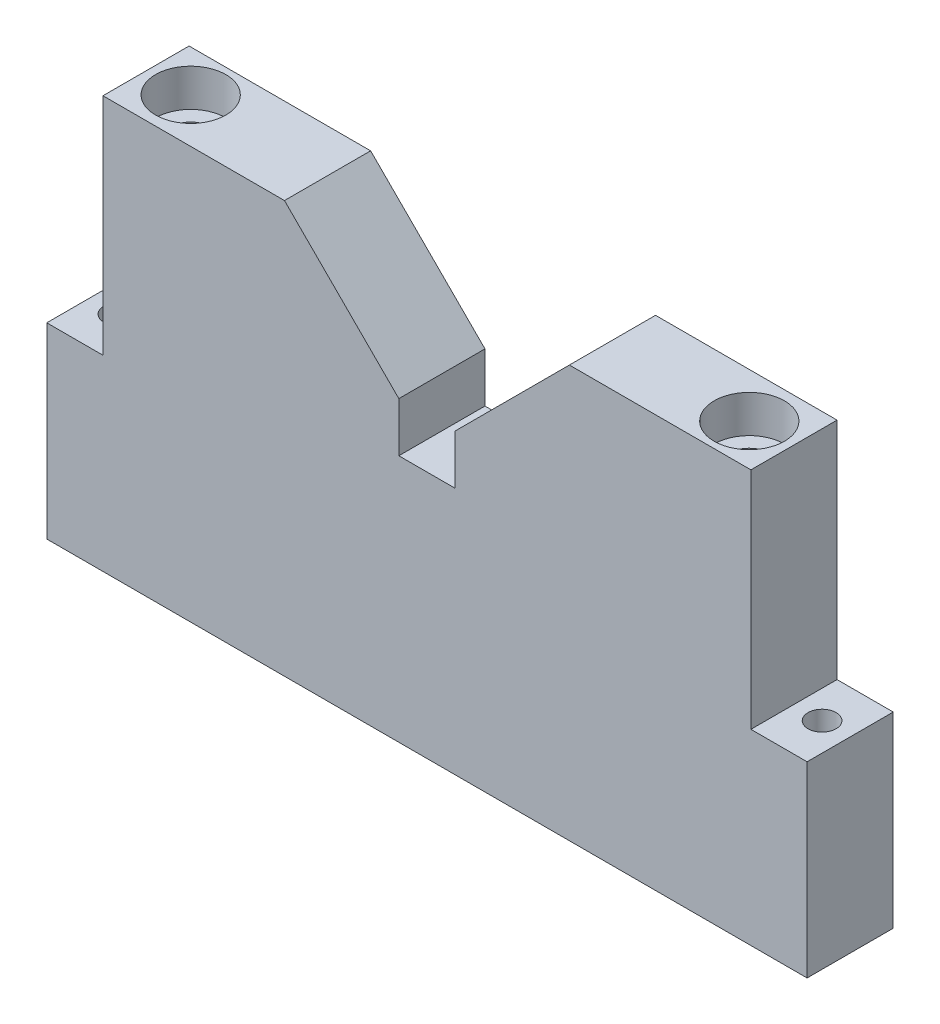
ISO-10303-21;
HEADER;
FILE_DESCRIPTION(('STEP AP214'),'2;1');
FILE_NAME('part.step','',(''),(''),'','','');
FILE_SCHEMA(('AUTOMOTIVE_DESIGN { 1 0 10303 214 1 1 1 1 }'));
ENDSEC;
DATA;
#1=APPLICATION_CONTEXT('core data for automotive mechanical design processes');
#2=APPLICATION_PROTOCOL_DEFINITION('international standard','automotive_design',2000,#1);
#3=PRODUCT_CONTEXT('',#1,'mechanical');
#4=PRODUCT('Part','Part','',(#3));
#5=PRODUCT_RELATED_PRODUCT_CATEGORY('part','',(#4));
#6=PRODUCT_DEFINITION_FORMATION('','',#4);
#7=PRODUCT_DEFINITION_CONTEXT('part definition',#1,'design');
#8=PRODUCT_DEFINITION('design','',#6,#7);
#9=PRODUCT_DEFINITION_SHAPE('','',#8);
#10=(LENGTH_UNIT() NAMED_UNIT(*) SI_UNIT(.MILLI.,.METRE.));
#11=(NAMED_UNIT(*) PLANE_ANGLE_UNIT() SI_UNIT($,.RADIAN.));
#12=(NAMED_UNIT(*) SI_UNIT($,.STERADIAN.) SOLID_ANGLE_UNIT());
#13=UNCERTAINTY_MEASURE_WITH_UNIT(LENGTH_MEASURE(1.E-05),#10,'distance_accuracy_value','');
#14=(GEOMETRIC_REPRESENTATION_CONTEXT(3) GLOBAL_UNCERTAINTY_ASSIGNED_CONTEXT((#13)) GLOBAL_UNIT_ASSIGNED_CONTEXT((#10,
#11,#12)) REPRESENTATION_CONTEXT('',''));
#15=CARTESIAN_POINT('',(0.,0.,0.));
#16=DIRECTION('',(0.,0.,1.));
#17=DIRECTION('',(1.,0.,0.));
#18=AXIS2_PLACEMENT_3D('',#15,#16,#17);
#19=CARTESIAN_POINT('',(-69.2,-60.,9.2));
#20=DIRECTION('',(1.,0.,0.));
#21=DIRECTION('',(0.,0.,-1.));
#22=AXIS2_PLACEMENT_3D('',#19,#20,#21);
#23=PLANE('',#22);
#24=DIRECTION('',(0.,-1.,0.));
#25=VECTOR('',#24,1.);
#26=CARTESIAN_POINT('',(-69.2,-60.,-9.2));
#27=LINE('',#26,#25);
#28=CARTESIAN_POINT('',(-69.2,-12.,-9.2));
#29=VERTEX_POINT('',#28);
#30=CARTESIAN_POINT('',(-69.2,-60.,-9.2));
#31=VERTEX_POINT('',#30);
#32=EDGE_CURVE('E182',#29,#31,#27,.T.);
#33=ORIENTED_EDGE('',*,*,#32,.T.);
#34=DIRECTION('',(0.,0.,-1.));
#35=VECTOR('',#34,1.);
#36=CARTESIAN_POINT('',(-69.2,-60.,9.2));
#37=LINE('',#36,#35);
#38=CARTESIAN_POINT('',(-69.2,-60.,9.2));
#39=VERTEX_POINT('',#38);
#40=EDGE_CURVE('E11',#39,#31,#37,.T.);
#41=ORIENTED_EDGE('',*,*,#40,.F.);
#42=DIRECTION('',(0.,-1.,0.));
#43=VECTOR('',#42,1.);
#44=CARTESIAN_POINT('',(-69.2,-60.,9.2));
#45=LINE('',#44,#43);
#46=CARTESIAN_POINT('',(-69.2,-12.,9.2));
#47=VERTEX_POINT('',#46);
#48=EDGE_CURVE('E95',#47,#39,#45,.T.);
#49=ORIENTED_EDGE('',*,*,#48,.F.);
#50=DIRECTION('',(0.,0.,-1.));
#51=VECTOR('',#50,1.);
#52=CARTESIAN_POINT('',(-69.2,-12.,9.2));
#53=LINE('',#52,#51);
#54=EDGE_CURVE('E138',#47,#29,#53,.T.);
#55=ORIENTED_EDGE('',*,*,#54,.T.);
#56=EDGE_LOOP('',(#33,#41,#49,#55));
#57=FACE_BOUND('',#56,.T.);
#58=ADVANCED_FACE('F32',(#57),#23,.F.);
#59=CARTESIAN_POINT('',(69.2,-12.,9.2));
#60=DIRECTION('',(-1.,0.,0.));
#61=DIRECTION('',(0.,0.,1.));
#62=AXIS2_PLACEMENT_3D('',#59,#60,#61);
#63=PLANE('',#62);
#64=DIRECTION('',(0.,1.,0.));
#65=VECTOR('',#64,1.);
#66=CARTESIAN_POINT('',(69.2,-12.,-9.2));
#67=LINE('',#66,#65);
#68=CARTESIAN_POINT('',(69.2,-60.,-9.2));
#69=VERTEX_POINT('',#68);
#70=CARTESIAN_POINT('',(69.2,-12.,-9.2));
#71=VERTEX_POINT('',#70);
#72=EDGE_CURVE('E145',#69,#71,#67,.T.);
#73=ORIENTED_EDGE('',*,*,#72,.T.);
#74=DIRECTION('',(0.,0.,-1.));
#75=VECTOR('',#74,1.);
#76=CARTESIAN_POINT('',(69.2,-12.,9.2));
#77=LINE('',#76,#75);
#78=CARTESIAN_POINT('',(69.2,-12.,9.2));
#79=VERTEX_POINT('',#78);
#80=EDGE_CURVE('E166',#79,#71,#77,.T.);
#81=ORIENTED_EDGE('',*,*,#80,.F.);
#82=DIRECTION('',(0.,1.,0.));
#83=VECTOR('',#82,1.);
#84=CARTESIAN_POINT('',(69.2,-12.,9.2));
#85=LINE('',#84,#83);
#86=CARTESIAN_POINT('',(69.2,-60.,9.2));
#87=VERTEX_POINT('',#86);
#88=EDGE_CURVE('E178',#87,#79,#85,.T.);
#89=ORIENTED_EDGE('',*,*,#88,.F.);
#90=DIRECTION('',(0.,0.,-1.));
#91=VECTOR('',#90,1.);
#92=CARTESIAN_POINT('',(69.2,-60.,9.2));
#93=LINE('',#92,#91);
#94=EDGE_CURVE('E41',#87,#69,#93,.T.);
#95=ORIENTED_EDGE('',*,*,#94,.T.);
#96=EDGE_LOOP('',(#73,#81,#89,#95));
#97=FACE_BOUND('',#96,.T.);
#98=ADVANCED_FACE('F243',(#97),#63,.F.);
#99=CARTESIAN_POINT('',(30.4264068711928,-12.,9.2));
#100=DIRECTION('',(0.,-1.,0.));
#101=DIRECTION('',(0.,0.,-1.));
#102=AXIS2_PLACEMENT_3D('',#99,#100,#101);
#103=PLANE('',#102);
#104=CARTESIAN_POINT('',(60.,-12.,0.343824935617583));
#105=DIRECTION('',(0.,1.,0.));
#106=DIRECTION('',(0.,0.,1.));
#107=AXIS2_PLACEMENT_3D('',#104,#105,#106);
#108=CIRCLE('',#107,7.5);
#109=CARTESIAN_POINT('',(60.,-12.,7.84382493561758));
#110=VERTEX_POINT('',#109);
#111=EDGE_CURVE('E300',#110,#110,#108,.T.);
#112=ORIENTED_EDGE('',*,*,#111,.F.);
#113=EDGE_LOOP('',(#112));
#114=FACE_BOUND('',#113,.T.);
#115=DIRECTION('',(-1.,0.,0.));
#116=VECTOR('',#115,1.);
#117=CARTESIAN_POINT('',(30.4264068711928,-12.,-9.2));
#118=LINE('',#117,#116);
#119=CARTESIAN_POINT('',(30.4264068711928,-12.,-9.2));
#120=VERTEX_POINT('',#119);
#121=EDGE_CURVE('E142',#71,#120,#118,.T.);
#122=ORIENTED_EDGE('',*,*,#121,.T.);
#123=DIRECTION('',(0.,0.,-1.));
#124=VECTOR('',#123,1.);
#125=CARTESIAN_POINT('',(30.4264068711928,-12.,9.2));
#126=LINE('',#125,#124);
#127=CARTESIAN_POINT('',(30.4264068711928,-12.,9.2));
#128=VERTEX_POINT('',#127);
#129=EDGE_CURVE('E163',#128,#120,#126,.T.);
#130=ORIENTED_EDGE('',*,*,#129,.F.);
#131=DIRECTION('',(-1.,0.,0.));
#132=VECTOR('',#131,1.);
#133=CARTESIAN_POINT('',(30.4264068711928,-12.,9.2));
#134=LINE('',#133,#132);
#135=EDGE_CURVE('E180',#79,#128,#134,.T.);
#136=ORIENTED_EDGE('',*,*,#135,.F.);
#137=ORIENTED_EDGE('',*,*,#80,.T.);
#138=EDGE_LOOP('',(#122,#130,#136,#137));
#139=FACE_BOUND('',#138,.T.);
#140=ADVANCED_FACE('F251',(#114,#139),#103,.F.);
#141=CARTESIAN_POINT('',(6.00000000000001,-36.4264068711929,9.2));
#142=DIRECTION('',(0.707106781186548,-0.707106781186547,0.));
#143=DIRECTION('',(0.707106781186547,0.707106781186548,0.));
#144=AXIS2_PLACEMENT_3D('',#141,#142,#143);
#145=PLANE('',#144);
#146=DIRECTION('',(-0.707106781186547,-0.707106781186548,0.));
#147=VECTOR('',#146,1.);
#148=CARTESIAN_POINT('',(6.00000000000001,-36.4264068711929,-9.2));
#149=LINE('',#148,#147);
#150=CARTESIAN_POINT('',(6.00000000000001,-36.4264068711929,-9.2));
#151=VERTEX_POINT('',#150);
#152=EDGE_CURVE('E144',#120,#151,#149,.T.);
#153=ORIENTED_EDGE('',*,*,#152,.T.);
#154=DIRECTION('',(0.,0.,-1.));
#155=VECTOR('',#154,1.);
#156=CARTESIAN_POINT('',(6.00000000000001,-36.4264068711929,9.2));
#157=LINE('',#156,#155);
#158=CARTESIAN_POINT('',(6.00000000000001,-36.4264068711929,9.2));
#159=VERTEX_POINT('',#158);
#160=EDGE_CURVE('E160',#159,#151,#157,.T.);
#161=ORIENTED_EDGE('',*,*,#160,.F.);
#162=DIRECTION('',(-0.707106781186547,-0.707106781186548,0.));
#163=VECTOR('',#162,1.);
#164=CARTESIAN_POINT('',(6.00000000000001,-36.4264068711929,9.2));
#165=LINE('',#164,#163);
#166=EDGE_CURVE('E257',#128,#159,#165,.T.);
#167=ORIENTED_EDGE('',*,*,#166,.F.);
#168=ORIENTED_EDGE('',*,*,#129,.T.);
#169=EDGE_LOOP('',(#153,#161,#167,#168));
#170=FACE_BOUND('',#169,.T.);
#171=ADVANCED_FACE('F255',(#170),#145,.F.);
#172=CARTESIAN_POINT('',(6.,-47.0000000000001,9.2));
#173=DIRECTION('',(1.,0.,0.));
#174=DIRECTION('',(0.,1.,0.));
#175=AXIS2_PLACEMENT_3D('',#172,#173,#174);
#176=PLANE('',#175);
#177=DIRECTION('',(0.,-1.,0.));
#178=VECTOR('',#177,1.);
#179=CARTESIAN_POINT('',(6.,-47.0000000000001,-9.2));
#180=LINE('',#179,#178);
#181=CARTESIAN_POINT('',(6.,-47.0000000000001,-9.2));
#182=VERTEX_POINT('',#181);
#183=EDGE_CURVE('E147',#151,#182,#180,.T.);
#184=ORIENTED_EDGE('',*,*,#183,.T.);
#185=DIRECTION('',(0.,0.,-1.));
#186=VECTOR('',#185,1.);
#187=CARTESIAN_POINT('',(6.,-47.0000000000001,9.2));
#188=LINE('',#187,#186);
#189=CARTESIAN_POINT('',(6.,-47.0000000000001,9.2));
#190=VERTEX_POINT('',#189);
#191=EDGE_CURVE('E157',#190,#182,#188,.T.);
#192=ORIENTED_EDGE('',*,*,#191,.F.);
#193=DIRECTION('',(0.,-1.,0.));
#194=VECTOR('',#193,1.);
#195=CARTESIAN_POINT('',(6.,-47.0000000000001,9.2));
#196=LINE('',#195,#194);
#197=EDGE_CURVE('E259',#159,#190,#196,.T.);
#198=ORIENTED_EDGE('',*,*,#197,.F.);
#199=ORIENTED_EDGE('',*,*,#160,.T.);
#200=EDGE_LOOP('',(#184,#192,#198,#199));
#201=FACE_BOUND('',#200,.T.);
#202=ADVANCED_FACE('F349',(#201),#176,.F.);
#203=CARTESIAN_POINT('',(-5.99999999999999,-47.0000000000001,9.2));
#204=DIRECTION('',(0.,-1.,0.));
#205=DIRECTION('',(1.,0.,0.));
#206=AXIS2_PLACEMENT_3D('',#203,#204,#205);
#207=PLANE('',#206);
#208=DIRECTION('',(-1.,0.,0.));
#209=VECTOR('',#208,1.);
#210=CARTESIAN_POINT('',(-5.99999999999999,-47.0000000000001,-9.2));
#211=LINE('',#210,#209);
#212=CARTESIAN_POINT('',(-5.99999999999999,-47.0000000000001,-9.2));
#213=VERTEX_POINT('',#212);
#214=EDGE_CURVE('E149',#182,#213,#211,.T.);
#215=ORIENTED_EDGE('',*,*,#214,.T.);
#216=DIRECTION('',(0.,0.,-1.));
#217=VECTOR('',#216,1.);
#218=CARTESIAN_POINT('',(-5.99999999999999,-47.0000000000001,9.2));
#219=LINE('',#218,#217);
#220=CARTESIAN_POINT('',(-5.99999999999999,-47.0000000000001,9.2));
#221=VERTEX_POINT('',#220);
#222=EDGE_CURVE('E133',#221,#213,#219,.T.);
#223=ORIENTED_EDGE('',*,*,#222,.F.);
#224=DIRECTION('',(-1.,0.,0.));
#225=VECTOR('',#224,1.);
#226=CARTESIAN_POINT('',(-5.99999999999999,-47.0000000000001,9.2));
#227=LINE('',#226,#225);
#228=EDGE_CURVE('E124',#190,#221,#227,.T.);
#229=ORIENTED_EDGE('',*,*,#228,.F.);
#230=ORIENTED_EDGE('',*,*,#191,.T.);
#231=EDGE_LOOP('',(#215,#223,#229,#230));
#232=FACE_BOUND('',#231,.T.);
#233=ADVANCED_FACE('F352',(#232),#207,.F.);
#234=CARTESIAN_POINT('',(-5.99999999999999,-36.4264068711928,9.2));
#235=DIRECTION('',(-1.,0.,0.));
#236=DIRECTION('',(0.,0.,1.));
#237=AXIS2_PLACEMENT_3D('',#234,#235,#236);
#238=PLANE('',#237);
#239=DIRECTION('',(0.,1.,0.));
#240=VECTOR('',#239,1.);
#241=CARTESIAN_POINT('',(-5.99999999999999,-36.4264068711928,-9.2));
#242=LINE('',#241,#240);
#243=CARTESIAN_POINT('',(-5.99999999999999,-36.4264068711928,-9.2));
#244=VERTEX_POINT('',#243);
#245=EDGE_CURVE('E132',#213,#244,#242,.T.);
#246=ORIENTED_EDGE('',*,*,#245,.T.);
#247=DIRECTION('',(0.,0.,-1.));
#248=VECTOR('',#247,1.);
#249=CARTESIAN_POINT('',(-5.99999999999999,-36.4264068711928,9.2));
#250=LINE('',#249,#248);
#251=CARTESIAN_POINT('',(-5.99999999999999,-36.4264068711928,9.2));
#252=VERTEX_POINT('',#251);
#253=EDGE_CURVE('E129',#252,#244,#250,.T.);
#254=ORIENTED_EDGE('',*,*,#253,.F.);
#255=DIRECTION('',(0.,1.,0.));
#256=VECTOR('',#255,1.);
#257=CARTESIAN_POINT('',(-5.99999999999999,-36.4264068711928,9.2));
#258=LINE('',#257,#256);
#259=EDGE_CURVE('E118',#221,#252,#258,.T.);
#260=ORIENTED_EDGE('',*,*,#259,.F.);
#261=ORIENTED_EDGE('',*,*,#222,.T.);
#262=EDGE_LOOP('',(#246,#254,#260,#261));
#263=FACE_BOUND('',#262,.T.);
#264=ADVANCED_FACE('F130',(#263),#238,.F.);
#265=CARTESIAN_POINT('',(-30.4264068711928,-12.,9.2));
#266=DIRECTION('',(-0.707106781186547,-0.707106781186548,0.));
#267=DIRECTION('',(0.707106781186548,-0.707106781186547,0.));
#268=AXIS2_PLACEMENT_3D('',#265,#266,#267);
#269=PLANE('',#268);
#270=DIRECTION('',(-0.707106781186548,0.707106781186547,0.));
#271=VECTOR('',#270,1.);
#272=CARTESIAN_POINT('',(-30.4264068711928,-12.,-9.2));
#273=LINE('',#272,#271);
#274=CARTESIAN_POINT('',(-30.4264068711928,-12.,-9.2));
#275=VERTEX_POINT('',#274);
#276=EDGE_CURVE('E83',#244,#275,#273,.T.);
#277=ORIENTED_EDGE('',*,*,#276,.T.);
#278=DIRECTION('',(0.,0.,-1.));
#279=VECTOR('',#278,1.);
#280=CARTESIAN_POINT('',(-30.4264068711928,-12.,9.2));
#281=LINE('',#280,#279);
#282=CARTESIAN_POINT('',(-30.4264068711928,-12.,9.2));
#283=VERTEX_POINT('',#282);
#284=EDGE_CURVE('E134',#283,#275,#281,.T.);
#285=ORIENTED_EDGE('',*,*,#284,.F.);
#286=DIRECTION('',(-0.707106781186548,0.707106781186547,0.));
#287=VECTOR('',#286,1.);
#288=CARTESIAN_POINT('',(-30.4264068711928,-12.,9.2));
#289=LINE('',#288,#287);
#290=EDGE_CURVE('E122',#252,#283,#289,.T.);
#291=ORIENTED_EDGE('',*,*,#290,.F.);
#292=ORIENTED_EDGE('',*,*,#253,.T.);
#293=EDGE_LOOP('',(#277,#285,#291,#292));
#294=FACE_BOUND('',#293,.T.);
#295=ADVANCED_FACE('F136',(#294),#269,.F.);
#296=CARTESIAN_POINT('',(-69.2,-12.,9.2));
#297=DIRECTION('',(0.,-1.,0.));
#298=DIRECTION('',(0.,0.,-1.));
#299=AXIS2_PLACEMENT_3D('',#296,#297,#298);
#300=PLANE('',#299);
#301=CARTESIAN_POINT('',(-60.,-12.,-0.343824935617591));
#302=DIRECTION('',(0.,1.,0.));
#303=DIRECTION('',(0.,0.,1.));
#304=AXIS2_PLACEMENT_3D('',#301,#302,#303);
#305=CIRCLE('',#304,7.49999999999999);
#306=CARTESIAN_POINT('',(-60.,-12.,7.1561750643824));
#307=VERTEX_POINT('',#306);
#308=EDGE_CURVE('E288',#307,#307,#305,.T.);
#309=ORIENTED_EDGE('',*,*,#308,.F.);
#310=EDGE_LOOP('',(#309));
#311=FACE_BOUND('',#310,.T.);
#312=DIRECTION('',(-1.,0.,0.));
#313=VECTOR('',#312,1.);
#314=CARTESIAN_POINT('',(-69.2,-12.,-9.2));
#315=LINE('',#314,#313);
#316=EDGE_CURVE('E89',#275,#29,#315,.T.);
#317=ORIENTED_EDGE('',*,*,#316,.T.);
#318=ORIENTED_EDGE('',*,*,#54,.F.);
#319=DIRECTION('',(-1.,0.,0.));
#320=VECTOR('',#319,1.);
#321=CARTESIAN_POINT('',(-69.2,-12.,9.2));
#322=LINE('',#321,#320);
#323=EDGE_CURVE('E50',#283,#47,#322,.T.);
#324=ORIENTED_EDGE('',*,*,#323,.F.);
#325=ORIENTED_EDGE('',*,*,#284,.T.);
#326=EDGE_LOOP('',(#317,#318,#324,#325));
#327=FACE_BOUND('',#326,.T.);
#328=ADVANCED_FACE('F361',(#311,#327),#300,.F.);
#329=CARTESIAN_POINT('',(-69.2,-12.,9.2));
#330=DIRECTION('',(0.,0.,-1.));
#331=DIRECTION('',(-1.,0.,0.));
#332=AXIS2_PLACEMENT_3D('',#329,#330,#331);
#333=PLANE('',#332);
#334=ORIENTED_EDGE('',*,*,#48,.T.);
#335=DIRECTION('',(-1.,0.,0.));
#336=VECTOR('',#335,1.);
#337=CARTESIAN_POINT('',(-81.2,-60.,9.2));
#338=LINE('',#337,#336);
#339=CARTESIAN_POINT('',(-81.2,-60.,9.2));
#340=VERTEX_POINT('',#339);
#341=EDGE_CURVE('E211',#39,#340,#338,.T.);
#342=ORIENTED_EDGE('',*,*,#341,.T.);
#343=DIRECTION('',(0.,1.,0.));
#344=VECTOR('',#343,1.);
#345=CARTESIAN_POINT('',(-81.2,-100.,9.2));
#346=LINE('',#345,#344);
#347=CARTESIAN_POINT('',(-81.2,-100.,9.2));
#348=VERTEX_POINT('',#347);
#349=EDGE_CURVE('E218',#348,#340,#346,.T.);
#350=ORIENTED_EDGE('',*,*,#349,.F.);
#351=DIRECTION('',(-1.,0.,0.));
#352=VECTOR('',#351,1.);
#353=CARTESIAN_POINT('',(-81.2,-100.,9.2));
#354=LINE('',#353,#352);
#355=CARTESIAN_POINT('',(81.2,-100.,9.2));
#356=VERTEX_POINT('',#355);
#357=EDGE_CURVE('E221',#356,#348,#354,.T.);
#358=ORIENTED_EDGE('',*,*,#357,.F.);
#359=DIRECTION('',(0.,1.,0.));
#360=VECTOR('',#359,1.);
#361=CARTESIAN_POINT('',(81.2,-100.,9.2));
#362=LINE('',#361,#360);
#363=CARTESIAN_POINT('',(81.2,-60.,9.2));
#364=VERTEX_POINT('',#363);
#365=EDGE_CURVE('E202',#356,#364,#362,.T.);
#366=ORIENTED_EDGE('',*,*,#365,.T.);
#367=EDGE_CURVE('E206',#364,#87,#338,.T.);
#368=ORIENTED_EDGE('',*,*,#367,.T.);
#369=ORIENTED_EDGE('',*,*,#88,.T.);
#370=ORIENTED_EDGE('',*,*,#135,.T.);
#371=ORIENTED_EDGE('',*,*,#166,.T.);
#372=ORIENTED_EDGE('',*,*,#197,.T.);
#373=ORIENTED_EDGE('',*,*,#228,.T.);
#374=ORIENTED_EDGE('',*,*,#259,.T.);
#375=ORIENTED_EDGE('',*,*,#290,.T.);
#376=ORIENTED_EDGE('',*,*,#323,.T.);
#377=EDGE_LOOP('',(#334,#342,#350,#358,#366,#368,#369,#370,#371,#372,#373,#374,#375,#376));
#378=FACE_BOUND('',#377,.T.);
#379=ADVANCED_FACE('F120',(#378),#333,.F.);
#380=CARTESIAN_POINT('',(-69.2,-12.,-9.2));
#381=DIRECTION('',(0.,0.,-1.));
#382=DIRECTION('',(-1.,0.,0.));
#383=AXIS2_PLACEMENT_3D('',#380,#381,#382);
#384=PLANE('',#383);
#385=ORIENTED_EDGE('',*,*,#32,.F.);
#386=ORIENTED_EDGE('',*,*,#316,.F.);
#387=ORIENTED_EDGE('',*,*,#276,.F.);
#388=ORIENTED_EDGE('',*,*,#245,.F.);
#389=ORIENTED_EDGE('',*,*,#214,.F.);
#390=ORIENTED_EDGE('',*,*,#183,.F.);
#391=ORIENTED_EDGE('',*,*,#152,.F.);
#392=ORIENTED_EDGE('',*,*,#121,.F.);
#393=ORIENTED_EDGE('',*,*,#72,.F.);
#394=DIRECTION('',(1.,0.,0.));
#395=VECTOR('',#394,1.);
#396=CARTESIAN_POINT('',(-81.2,-60.,-9.2));
#397=LINE('',#396,#395);
#398=CARTESIAN_POINT('',(81.2,-60.,-9.2));
#399=VERTEX_POINT('',#398);
#400=EDGE_CURVE('E242',#69,#399,#397,.T.);
#401=ORIENTED_EDGE('',*,*,#400,.T.);
#402=DIRECTION('',(0.,1.,0.));
#403=VECTOR('',#402,1.);
#404=CARTESIAN_POINT('',(81.2,-100.,-9.2));
#405=LINE('',#404,#403);
#406=CARTESIAN_POINT('',(81.2,-100.,-9.2));
#407=VERTEX_POINT('',#406);
#408=EDGE_CURVE('E191',#407,#399,#405,.T.);
#409=ORIENTED_EDGE('',*,*,#408,.F.);
#410=DIRECTION('',(1.,0.,0.));
#411=VECTOR('',#410,1.);
#412=CARTESIAN_POINT('',(-81.2,-100.,-9.2));
#413=LINE('',#412,#411);
#414=CARTESIAN_POINT('',(-81.2,-100.,-9.2));
#415=VERTEX_POINT('',#414);
#416=EDGE_CURVE('E275',#415,#407,#413,.T.);
#417=ORIENTED_EDGE('',*,*,#416,.F.);
#418=DIRECTION('',(0.,1.,0.));
#419=VECTOR('',#418,1.);
#420=CARTESIAN_POINT('',(-81.2,-100.,-9.2));
#421=LINE('',#420,#419);
#422=CARTESIAN_POINT('',(-81.2,-60.,-9.2));
#423=VERTEX_POINT('',#422);
#424=EDGE_CURVE('E187',#415,#423,#421,.T.);
#425=ORIENTED_EDGE('',*,*,#424,.T.);
#426=EDGE_CURVE('E264',#423,#31,#397,.T.);
#427=ORIENTED_EDGE('',*,*,#426,.T.);
#428=EDGE_LOOP('',(#385,#386,#387,#388,#389,#390,#391,#392,#393,#401,#409,#417,#425,#427));
#429=FACE_BOUND('',#428,.T.);
#430=ADVANCED_FACE('F245',(#429),#384,.T.);
#431=CARTESIAN_POINT('',(-81.2,-60.,-9.2));
#432=DIRECTION('',(0.,-1.,0.));
#433=DIRECTION('',(0.,0.,-1.));
#434=AXIS2_PLACEMENT_3D('',#431,#432,#433);
#435=PLANE('',#434);
#436=CARTESIAN_POINT('',(-75.2,-60.,0.));
#437=DIRECTION('',(0.,1.,0.));
#438=DIRECTION('',(0.,0.,1.));
#439=AXIS2_PLACEMENT_3D('',#436,#437,#438);
#440=CIRCLE('',#439,2.99999999999999);
#441=CARTESIAN_POINT('',(-75.2,-60.,2.99999999999999));
#442=VERTEX_POINT('',#441);
#443=EDGE_CURVE('E306',#442,#442,#440,.T.);
#444=ORIENTED_EDGE('',*,*,#443,.F.);
#445=EDGE_LOOP('',(#444));
#446=FACE_BOUND('',#445,.T.);
#447=ORIENTED_EDGE('',*,*,#341,.F.);
#448=ORIENTED_EDGE('',*,*,#40,.T.);
#449=ORIENTED_EDGE('',*,*,#426,.F.);
#450=DIRECTION('',(0.,0.,-1.));
#451=VECTOR('',#450,1.);
#452=CARTESIAN_POINT('',(-81.2,-60.,9.2));
#453=LINE('',#452,#451);
#454=EDGE_CURVE('E265',#340,#423,#453,.T.);
#455=ORIENTED_EDGE('',*,*,#454,.F.);
#456=EDGE_LOOP('',(#447,#448,#449,#455));
#457=FACE_BOUND('',#456,.T.);
#458=ADVANCED_FACE('F322',(#446,#457),#435,.F.);
#459=CARTESIAN_POINT('',(-81.2,-100.,9.2));
#460=DIRECTION('',(1.,0.,0.));
#461=DIRECTION('',(0.,0.,-1.));
#462=AXIS2_PLACEMENT_3D('',#459,#460,#461);
#463=PLANE('',#462);
#464=ORIENTED_EDGE('',*,*,#454,.T.);
#465=ORIENTED_EDGE('',*,*,#424,.F.);
#466=DIRECTION('',(0.,0.,-1.));
#467=VECTOR('',#466,1.);
#468=CARTESIAN_POINT('',(-81.2,-100.,9.2));
#469=LINE('',#468,#467);
#470=EDGE_CURVE('E210',#348,#415,#469,.T.);
#471=ORIENTED_EDGE('',*,*,#470,.F.);
#472=ORIENTED_EDGE('',*,*,#349,.T.);
#473=EDGE_LOOP('',(#464,#465,#471,#472));
#474=FACE_BOUND('',#473,.T.);
#475=ADVANCED_FACE('F335',(#474),#463,.F.);
#476=CARTESIAN_POINT('',(81.2,-100.,9.2));
#477=DIRECTION('',(-1.,0.,0.));
#478=DIRECTION('',(0.,0.,1.));
#479=AXIS2_PLACEMENT_3D('',#476,#477,#478);
#480=PLANE('',#479);
#481=DIRECTION('',(0.,0.,1.));
#482=VECTOR('',#481,1.);
#483=CARTESIAN_POINT('',(81.2,-60.,9.2));
#484=LINE('',#483,#482);
#485=EDGE_CURVE('E216',#399,#364,#484,.T.);
#486=ORIENTED_EDGE('',*,*,#485,.T.);
#487=ORIENTED_EDGE('',*,*,#365,.F.);
#488=DIRECTION('',(0.,0.,1.));
#489=VECTOR('',#488,1.);
#490=CARTESIAN_POINT('',(81.2,-100.,9.2));
#491=LINE('',#490,#489);
#492=EDGE_CURVE('E272',#407,#356,#491,.T.);
#493=ORIENTED_EDGE('',*,*,#492,.F.);
#494=ORIENTED_EDGE('',*,*,#408,.T.);
#495=EDGE_LOOP('',(#486,#487,#493,#494));
#496=FACE_BOUND('',#495,.T.);
#497=ADVANCED_FACE('F330',(#496),#480,.F.);
#498=CARTESIAN_POINT('',(-81.2,-100.,-9.2));
#499=DIRECTION('',(0.,-1.,0.));
#500=DIRECTION('',(0.,0.,-1.));
#501=AXIS2_PLACEMENT_3D('',#498,#499,#500);
#502=PLANE('',#501);
#503=CARTESIAN_POINT('',(75.2,-100.,0.));
#504=DIRECTION('',(0.,1.,0.));
#505=DIRECTION('',(0.,0.,1.));
#506=AXIS2_PLACEMENT_3D('',#503,#504,#505);
#507=CIRCLE('',#506,2.99999999999999);
#508=CARTESIAN_POINT('',(75.2,-100.,2.99999999999999));
#509=VERTEX_POINT('',#508);
#510=EDGE_CURVE('E309',#509,#509,#507,.T.);
#511=ORIENTED_EDGE('',*,*,#510,.T.);
#512=EDGE_LOOP('',(#511));
#513=FACE_BOUND('',#512,.T.);
#514=CARTESIAN_POINT('',(-75.2,-100.,0.));
#515=DIRECTION('',(0.,1.,0.));
#516=DIRECTION('',(0.,0.,1.));
#517=AXIS2_PLACEMENT_3D('',#514,#515,#516);
#518=CIRCLE('',#517,2.99999999999999);
#519=CARTESIAN_POINT('',(-75.2,-100.,2.99999999999999));
#520=VERTEX_POINT('',#519);
#521=EDGE_CURVE('E303',#520,#520,#518,.T.);
#522=ORIENTED_EDGE('',*,*,#521,.T.);
#523=EDGE_LOOP('',(#522));
#524=FACE_BOUND('',#523,.T.);
#525=CARTESIAN_POINT('',(60.,-100.,0.343824935617583));
#526=DIRECTION('',(0.,1.,0.));
#527=DIRECTION('',(0.,0.,1.));
#528=AXIS2_PLACEMENT_3D('',#525,#526,#527);
#529=CIRCLE('',#528,4.19999999999997);
#530=CARTESIAN_POINT('',(60.,-100.,4.54382493561756));
#531=VERTEX_POINT('',#530);
#532=EDGE_CURVE('E291',#531,#531,#529,.T.);
#533=ORIENTED_EDGE('',*,*,#532,.T.);
#534=EDGE_LOOP('',(#533));
#535=FACE_BOUND('',#534,.T.);
#536=CARTESIAN_POINT('',(-60.,-100.,-0.343824935617591));
#537=DIRECTION('',(0.,1.,0.));
#538=DIRECTION('',(0.,0.,1.));
#539=AXIS2_PLACEMENT_3D('',#536,#537,#538);
#540=CIRCLE('',#539,4.19999999999997);
#541=CARTESIAN_POINT('',(-60.,-100.,3.85617506438238));
#542=VERTEX_POINT('',#541);
#543=EDGE_CURVE('E270',#542,#542,#540,.T.);
#544=ORIENTED_EDGE('',*,*,#543,.T.);
#545=EDGE_LOOP('',(#544));
#546=FACE_BOUND('',#545,.T.);
#547=ORIENTED_EDGE('',*,*,#470,.T.);
#548=ORIENTED_EDGE('',*,*,#416,.T.);
#549=ORIENTED_EDGE('',*,*,#492,.T.);
#550=ORIENTED_EDGE('',*,*,#357,.T.);
#551=EDGE_LOOP('',(#547,#548,#549,#550));
#552=FACE_BOUND('',#551,.T.);
#553=ADVANCED_FACE('F320',(#513,#524,#535,#546,#552),#502,.T.);
#554=CARTESIAN_POINT('',(75.2,-60.,0.));
#555=DIRECTION('',(0.,1.,0.));
#556=DIRECTION('',(0.,0.,1.));
#557=AXIS2_PLACEMENT_3D('',#554,#555,#556);
#558=CIRCLE('',#557,2.99999999999999);
#559=CARTESIAN_POINT('',(75.2,-60.,2.99999999999999));
#560=VERTEX_POINT('',#559);
#561=EDGE_CURVE('E312',#560,#560,#558,.T.);
#562=ORIENTED_EDGE('',*,*,#561,.F.);
#563=EDGE_LOOP('',(#562));
#564=FACE_BOUND('',#563,.T.);
#565=ORIENTED_EDGE('',*,*,#94,.F.);
#566=ORIENTED_EDGE('',*,*,#367,.F.);
#567=ORIENTED_EDGE('',*,*,#485,.F.);
#568=ORIENTED_EDGE('',*,*,#400,.F.);
#569=EDGE_LOOP('',(#565,#566,#567,#568));
#570=FACE_BOUND('',#569,.T.);
#571=ADVANCED_FACE('F239',(#564,#570),#435,.F.);
#572=CARTESIAN_POINT('',(-60.,-12.,-0.343824935617591));
#573=DIRECTION('',(0.,1.,0.));
#574=DIRECTION('',(0.,0.,1.));
#575=AXIS2_PLACEMENT_3D('',#572,#573,#574);
#576=CYLINDRICAL_SURFACE('',#575,4.19999999999999);
#577=ORIENTED_EDGE('',*,*,#543,.F.);
#578=EDGE_LOOP('',(#577));
#579=FACE_BOUND('',#578,.T.);
#580=CARTESIAN_POINT('',(-60.,-20.,-0.343824935617591));
#581=DIRECTION('',(0.,1.,0.));
#582=DIRECTION('',(0.,0.,1.));
#583=AXIS2_PLACEMENT_3D('',#580,#581,#582);
#584=CIRCLE('',#583,4.20000000000001);
#585=CARTESIAN_POINT('',(-60.,-20.,3.85617506438242));
#586=VERTEX_POINT('',#585);
#587=EDGE_CURVE('E282',#586,#586,#584,.T.);
#588=ORIENTED_EDGE('',*,*,#587,.T.);
#589=EDGE_LOOP('',(#588));
#590=FACE_BOUND('',#589,.T.);
#591=ADVANCED_FACE('F319',(#579,#590),#576,.F.);
#592=CARTESIAN_POINT('',(-55.8,-20.,-0.343824935617591));
#593=DIRECTION('',(0.,-1.,0.));
#594=DIRECTION('',(0.,0.,-1.));
#595=AXIS2_PLACEMENT_3D('',#592,#593,#594);
#596=PLANE('',#595);
#597=ORIENTED_EDGE('',*,*,#587,.F.);
#598=EDGE_LOOP('',(#597));
#599=FACE_BOUND('',#598,.T.);
#600=CARTESIAN_POINT('',(-60.,-20.,-0.343824935617591));
#601=DIRECTION('',(0.,1.,0.));
#602=DIRECTION('',(0.,0.,1.));
#603=AXIS2_PLACEMENT_3D('',#600,#601,#602);
#604=CIRCLE('',#603,7.5);
#605=CARTESIAN_POINT('',(-60.,-20.,7.15617506438241));
#606=VERTEX_POINT('',#605);
#607=EDGE_CURVE('E285',#606,#606,#604,.T.);
#608=ORIENTED_EDGE('',*,*,#607,.T.);
#609=EDGE_LOOP('',(#608));
#610=FACE_BOUND('',#609,.T.);
#611=ADVANCED_FACE('F327',(#599,#610),#596,.F.);
#612=CARTESIAN_POINT('',(-60.,-12.,-0.343824935617591));
#613=DIRECTION('',(0.,1.,0.));
#614=DIRECTION('',(0.,0.,1.));
#615=AXIS2_PLACEMENT_3D('',#612,#613,#614);
#616=CYLINDRICAL_SURFACE('',#615,7.5);
#617=ORIENTED_EDGE('',*,*,#607,.F.);
#618=EDGE_LOOP('',(#617));
#619=FACE_BOUND('',#618,.T.);
#620=ORIENTED_EDGE('',*,*,#308,.T.);
#621=EDGE_LOOP('',(#620));
#622=FACE_BOUND('',#621,.T.);
#623=ADVANCED_FACE('F444',(#619,#622),#616,.F.);
#624=CARTESIAN_POINT('',(60.,-12.,0.343824935617583));
#625=DIRECTION('',(0.,1.,0.));
#626=DIRECTION('',(0.,0.,1.));
#627=AXIS2_PLACEMENT_3D('',#624,#625,#626);
#628=CYLINDRICAL_SURFACE('',#627,4.2);
#629=ORIENTED_EDGE('',*,*,#532,.F.);
#630=EDGE_LOOP('',(#629));
#631=FACE_BOUND('',#630,.T.);
#632=CARTESIAN_POINT('',(60.,-20.,0.343824935617583));
#633=DIRECTION('',(0.,1.,0.));
#634=DIRECTION('',(0.,0.,1.));
#635=AXIS2_PLACEMENT_3D('',#632,#633,#634);
#636=CIRCLE('',#635,4.20000000000002);
#637=CARTESIAN_POINT('',(60.,-20.,4.5438249356176));
#638=VERTEX_POINT('',#637);
#639=EDGE_CURVE('E294',#638,#638,#636,.T.);
#640=ORIENTED_EDGE('',*,*,#639,.T.);
#641=EDGE_LOOP('',(#640));
#642=FACE_BOUND('',#641,.T.);
#643=ADVANCED_FACE('F440',(#631,#642),#628,.F.);
#644=CARTESIAN_POINT('',(64.2,-20.,0.343824935617583));
#645=DIRECTION('',(0.,-1.,0.));
#646=DIRECTION('',(0.,0.,-1.));
#647=AXIS2_PLACEMENT_3D('',#644,#645,#646);
#648=PLANE('',#647);
#649=ORIENTED_EDGE('',*,*,#639,.F.);
#650=EDGE_LOOP('',(#649));
#651=FACE_BOUND('',#650,.T.);
#652=CARTESIAN_POINT('',(60.,-20.,0.343824935617583));
#653=DIRECTION('',(0.,1.,0.));
#654=DIRECTION('',(0.,0.,1.));
#655=AXIS2_PLACEMENT_3D('',#652,#653,#654);
#656=CIRCLE('',#655,7.5);
#657=CARTESIAN_POINT('',(60.,-20.,7.84382493561758));
#658=VERTEX_POINT('',#657);
#659=EDGE_CURVE('E297',#658,#658,#656,.T.);
#660=ORIENTED_EDGE('',*,*,#659,.T.);
#661=EDGE_LOOP('',(#660));
#662=FACE_BOUND('',#661,.T.);
#663=ADVANCED_FACE('F436',(#651,#662),#648,.F.);
#664=CARTESIAN_POINT('',(60.,-12.,0.343824935617583));
#665=DIRECTION('',(0.,1.,0.));
#666=DIRECTION('',(0.,0.,1.));
#667=AXIS2_PLACEMENT_3D('',#664,#665,#666);
#668=CYLINDRICAL_SURFACE('',#667,7.5);
#669=ORIENTED_EDGE('',*,*,#659,.F.);
#670=EDGE_LOOP('',(#669));
#671=FACE_BOUND('',#670,.T.);
#672=ORIENTED_EDGE('',*,*,#111,.T.);
#673=EDGE_LOOP('',(#672));
#674=FACE_BOUND('',#673,.T.);
#675=ADVANCED_FACE('F417',(#671,#674),#668,.F.);
#676=CARTESIAN_POINT('',(-75.2,-60.,0.));
#677=DIRECTION('',(0.,1.,0.));
#678=DIRECTION('',(0.,0.,1.));
#679=AXIS2_PLACEMENT_3D('',#676,#677,#678);
#680=CYLINDRICAL_SURFACE('',#679,2.99999999999999);
#681=ORIENTED_EDGE('',*,*,#521,.F.);
#682=EDGE_LOOP('',(#681));
#683=FACE_BOUND('',#682,.T.);
#684=ORIENTED_EDGE('',*,*,#443,.T.);
#685=EDGE_LOOP('',(#684));
#686=FACE_BOUND('',#685,.T.);
#687=ADVANCED_FACE('F412',(#683,#686),#680,.F.);
#688=CARTESIAN_POINT('',(75.2,-60.,0.));
#689=DIRECTION('',(0.,1.,0.));
#690=DIRECTION('',(0.,0.,1.));
#691=AXIS2_PLACEMENT_3D('',#688,#689,#690);
#692=CYLINDRICAL_SURFACE('',#691,2.99999999999999);
#693=ORIENTED_EDGE('',*,*,#510,.F.);
#694=EDGE_LOOP('',(#693));
#695=FACE_BOUND('',#694,.T.);
#696=ORIENTED_EDGE('',*,*,#561,.T.);
#697=EDGE_LOOP('',(#696));
#698=FACE_BOUND('',#697,.T.);
#699=ADVANCED_FACE('F316',(#695,#698),#692,.F.);
#700=CLOSED_SHELL('',(#58,#98,#140,#171,#202,#233,#264,#295,#328,#379,#430,#458,#475,#497,#553,
#571,#591,#611,#623,#643,#663,#675,#687,#699));
#701=MANIFOLD_SOLID_BREP('B2',#700);
#702=ADVANCED_BREP_SHAPE_REPRESENTATION('',(#18,#701),#14);
#703=SHAPE_DEFINITION_REPRESENTATION(#9,#702);
ENDSEC;
END-ISO-10303-21;
